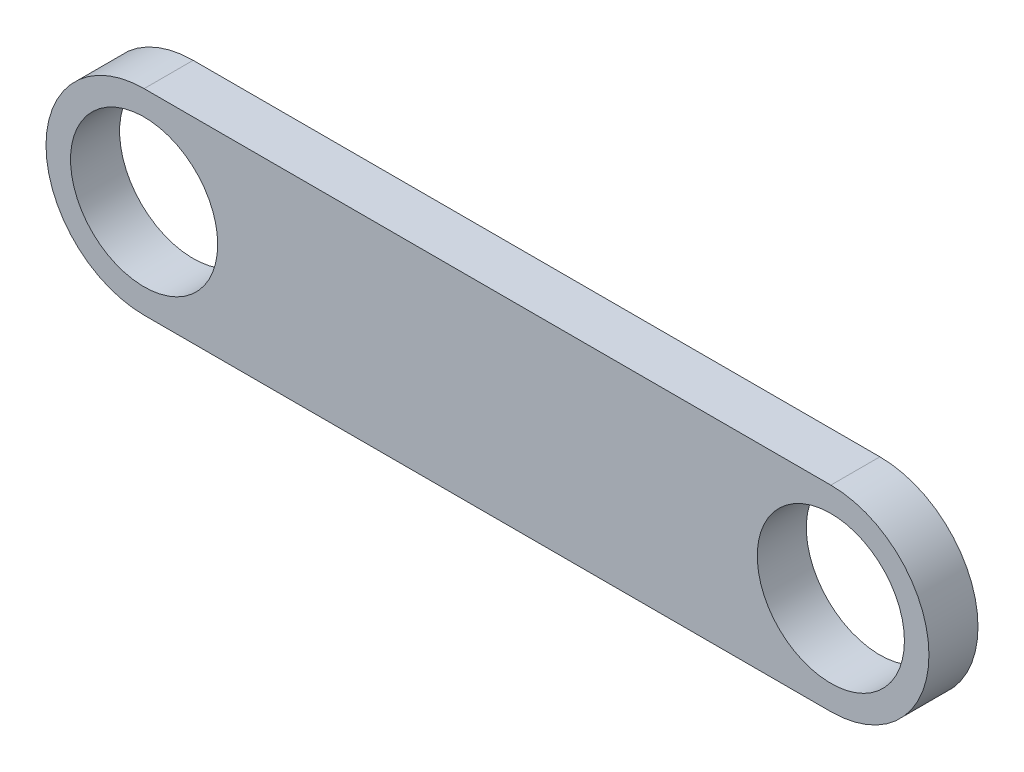
ISO-10303-21;
HEADER;
FILE_DESCRIPTION(('STEP AP214'),'2;1');
FILE_NAME('part.step','',(''),(''),'','','');
FILE_SCHEMA(('AUTOMOTIVE_DESIGN { 1 0 10303 214 1 1 1 1 }'));
ENDSEC;
DATA;
#1=APPLICATION_CONTEXT('core data for automotive mechanical design processes');
#2=APPLICATION_PROTOCOL_DEFINITION('international standard','automotive_design',2000,#1);
#3=PRODUCT_CONTEXT('',#1,'mechanical');
#4=PRODUCT('Part','Part','',(#3));
#5=PRODUCT_RELATED_PRODUCT_CATEGORY('part','',(#4));
#6=PRODUCT_DEFINITION_FORMATION('','',#4);
#7=PRODUCT_DEFINITION_CONTEXT('part definition',#1,'design');
#8=PRODUCT_DEFINITION('design','',#6,#7);
#9=PRODUCT_DEFINITION_SHAPE('','',#8);
#10=(LENGTH_UNIT() NAMED_UNIT(*) SI_UNIT(.MILLI.,.METRE.));
#11=(NAMED_UNIT(*) PLANE_ANGLE_UNIT() SI_UNIT($,.RADIAN.));
#12=(NAMED_UNIT(*) SI_UNIT($,.STERADIAN.) SOLID_ANGLE_UNIT());
#13=UNCERTAINTY_MEASURE_WITH_UNIT(LENGTH_MEASURE(1.E-05),#10,'distance_accuracy_value','');
#14=(GEOMETRIC_REPRESENTATION_CONTEXT(3) GLOBAL_UNCERTAINTY_ASSIGNED_CONTEXT((#13)) GLOBAL_UNIT_ASSIGNED_CONTEXT((#10,
#11,#12)) REPRESENTATION_CONTEXT('',''));
#15=CARTESIAN_POINT('',(0.,0.,0.));
#16=DIRECTION('',(0.,0.,1.));
#17=DIRECTION('',(1.,0.,0.));
#18=AXIS2_PLACEMENT_3D('',#15,#16,#17);
#19=CARTESIAN_POINT('',(0.,0.,10.));
#20=DIRECTION('',(0.,0.,1.));
#21=DIRECTION('',(1.,0.,0.));
#22=AXIS2_PLACEMENT_3D('',#19,#20,#21);
#23=PLANE('',#22);
#24=CARTESIAN_POINT('',(0.,0.,10.));
#25=DIRECTION('',(0.,0.,1.));
#26=DIRECTION('',(1.,0.,0.));
#27=AXIS2_PLACEMENT_3D('',#24,#25,#26);
#28=CIRCLE('',#27,15.);
#29=CARTESIAN_POINT('',(15.,0.,10.));
#30=VERTEX_POINT('',#29);
#31=EDGE_CURVE('E116',#30,#30,#28,.T.);
#32=ORIENTED_EDGE('',*,*,#31,.F.);
#33=EDGE_LOOP('',(#32));
#34=FACE_BOUND('',#33,.T.);
#35=CARTESIAN_POINT('',(0.,0.,10.));
#36=DIRECTION('',(0.,0.,1.));
#37=DIRECTION('',(1.,0.,0.));
#38=AXIS2_PLACEMENT_3D('',#35,#36,#37);
#39=CIRCLE('',#38,20.);
#40=CARTESIAN_POINT('',(0.,20.,10.));
#41=VERTEX_POINT('',#40);
#42=CARTESIAN_POINT('',(0.,-20.,10.));
#43=VERTEX_POINT('',#42);
#44=EDGE_CURVE('E96',#41,#43,#39,.T.);
#45=ORIENTED_EDGE('',*,*,#44,.T.);
#46=DIRECTION('',(1.,0.,0.));
#47=VECTOR('',#46,1.);
#48=CARTESIAN_POINT('',(0.,-20.,10.));
#49=LINE('',#48,#47);
#50=CARTESIAN_POINT('',(140.,-20.,10.));
#51=VERTEX_POINT('',#50);
#52=EDGE_CURVE('E91',#43,#51,#49,.T.);
#53=ORIENTED_EDGE('',*,*,#52,.T.);
#54=CARTESIAN_POINT('',(140.,0.,10.));
#55=DIRECTION('',(0.,0.,1.));
#56=DIRECTION('',(1.,0.,0.));
#57=AXIS2_PLACEMENT_3D('',#54,#55,#56);
#58=CIRCLE('',#57,20.);
#59=CARTESIAN_POINT('',(140.,20.,10.));
#60=VERTEX_POINT('',#59);
#61=EDGE_CURVE('E94',#51,#60,#58,.T.);
#62=ORIENTED_EDGE('',*,*,#61,.T.);
#63=DIRECTION('',(-1.,0.,0.));
#64=VECTOR('',#63,1.);
#65=CARTESIAN_POINT('',(0.,20.,10.));
#66=LINE('',#65,#64);
#67=EDGE_CURVE('E61',#60,#41,#66,.T.);
#68=ORIENTED_EDGE('',*,*,#67,.T.);
#69=EDGE_LOOP('',(#45,#53,#62,#68));
#70=FACE_BOUND('',#69,.T.);
#71=CARTESIAN_POINT('',(140.,0.,10.));
#72=DIRECTION('',(0.,0.,1.));
#73=DIRECTION('',(1.,0.,0.));
#74=AXIS2_PLACEMENT_3D('',#71,#72,#73);
#75=CIRCLE('',#74,15.);
#76=CARTESIAN_POINT('',(155.,0.,10.));
#77=VERTEX_POINT('',#76);
#78=EDGE_CURVE('E138',#77,#77,#75,.T.);
#79=ORIENTED_EDGE('',*,*,#78,.F.);
#80=EDGE_LOOP('',(#79));
#81=FACE_BOUND('',#80,.T.);
#82=ADVANCED_FACE('F43',(#34,#70,#81),#23,.T.);
#83=CARTESIAN_POINT('',(0.,0.,0.));
#84=DIRECTION('',(0.,0.,1.));
#85=DIRECTION('',(1.,0.,0.));
#86=AXIS2_PLACEMENT_3D('',#83,#84,#85);
#87=PLANE('',#86);
#88=CARTESIAN_POINT('',(0.,0.,0.));
#89=DIRECTION('',(0.,0.,1.));
#90=DIRECTION('',(1.,0.,0.));
#91=AXIS2_PLACEMENT_3D('',#88,#89,#90);
#92=CIRCLE('',#91,20.);
#93=CARTESIAN_POINT('',(0.,20.,0.));
#94=VERTEX_POINT('',#93);
#95=CARTESIAN_POINT('',(0.,-20.,0.));
#96=VERTEX_POINT('',#95);
#97=EDGE_CURVE('E112',#94,#96,#92,.T.);
#98=ORIENTED_EDGE('',*,*,#97,.F.);
#99=DIRECTION('',(-1.,0.,0.));
#100=VECTOR('',#99,1.);
#101=CARTESIAN_POINT('',(0.,20.,0.));
#102=LINE('',#101,#100);
#103=CARTESIAN_POINT('',(140.,20.,0.));
#104=VERTEX_POINT('',#103);
#105=EDGE_CURVE('E84',#104,#94,#102,.T.);
#106=ORIENTED_EDGE('',*,*,#105,.F.);
#107=CARTESIAN_POINT('',(140.,0.,0.));
#108=DIRECTION('',(0.,0.,1.));
#109=DIRECTION('',(1.,0.,0.));
#110=AXIS2_PLACEMENT_3D('',#107,#108,#109);
#111=CIRCLE('',#110,20.);
#112=CARTESIAN_POINT('',(140.,-20.,0.));
#113=VERTEX_POINT('',#112);
#114=EDGE_CURVE('E78',#113,#104,#111,.T.);
#115=ORIENTED_EDGE('',*,*,#114,.F.);
#116=DIRECTION('',(1.,0.,0.));
#117=VECTOR('',#116,1.);
#118=CARTESIAN_POINT('',(0.,-20.,0.));
#119=LINE('',#118,#117);
#120=EDGE_CURVE('E101',#96,#113,#119,.T.);
#121=ORIENTED_EDGE('',*,*,#120,.F.);
#122=EDGE_LOOP('',(#98,#106,#115,#121));
#123=FACE_BOUND('',#122,.T.);
#124=CARTESIAN_POINT('',(0.,0.,0.));
#125=DIRECTION('',(0.,0.,1.));
#126=DIRECTION('',(1.,0.,0.));
#127=AXIS2_PLACEMENT_3D('',#124,#125,#126);
#128=CIRCLE('',#127,15.);
#129=CARTESIAN_POINT('',(15.,0.,0.));
#130=VERTEX_POINT('',#129);
#131=EDGE_CURVE('E134',#130,#130,#128,.T.);
#132=ORIENTED_EDGE('',*,*,#131,.T.);
#133=EDGE_LOOP('',(#132));
#134=FACE_BOUND('',#133,.T.);
#135=CARTESIAN_POINT('',(140.,0.,0.));
#136=DIRECTION('',(0.,0.,1.));
#137=DIRECTION('',(1.,0.,0.));
#138=AXIS2_PLACEMENT_3D('',#135,#136,#137);
#139=CIRCLE('',#138,15.);
#140=CARTESIAN_POINT('',(155.,0.,0.));
#141=VERTEX_POINT('',#140);
#142=EDGE_CURVE('E142',#141,#141,#139,.T.);
#143=ORIENTED_EDGE('',*,*,#142,.T.);
#144=EDGE_LOOP('',(#143));
#145=FACE_BOUND('',#144,.T.);
#146=ADVANCED_FACE('F129',(#123,#134,#145),#87,.F.);
#147=CARTESIAN_POINT('',(0.,0.,10.));
#148=DIRECTION('',(0.,0.,-1.));
#149=DIRECTION('',(-1.,0.,0.));
#150=AXIS2_PLACEMENT_3D('',#147,#148,#149);
#151=CYLINDRICAL_SURFACE('',#150,20.);
#152=ORIENTED_EDGE('',*,*,#97,.T.);
#153=DIRECTION('',(0.,0.,-1.));
#154=VECTOR('',#153,1.);
#155=CARTESIAN_POINT('',(0.,-20.,10.));
#156=LINE('',#155,#154);
#157=EDGE_CURVE('E11',#43,#96,#156,.T.);
#158=ORIENTED_EDGE('',*,*,#157,.F.);
#159=ORIENTED_EDGE('',*,*,#44,.F.);
#160=DIRECTION('',(0.,0.,-1.));
#161=VECTOR('',#160,1.);
#162=CARTESIAN_POINT('',(0.,20.,10.));
#163=LINE('',#162,#161);
#164=EDGE_CURVE('E108',#41,#94,#163,.T.);
#165=ORIENTED_EDGE('',*,*,#164,.T.);
#166=EDGE_LOOP('',(#152,#158,#159,#165));
#167=FACE_BOUND('',#166,.T.);
#168=ADVANCED_FACE('F45',(#167),#151,.T.);
#169=CARTESIAN_POINT('',(0.,-20.,10.));
#170=DIRECTION('',(0.,1.,0.));
#171=DIRECTION('',(0.,0.,1.));
#172=AXIS2_PLACEMENT_3D('',#169,#170,#171);
#173=PLANE('',#172);
#174=ORIENTED_EDGE('',*,*,#120,.T.);
#175=DIRECTION('',(0.,0.,-1.));
#176=VECTOR('',#175,1.);
#177=CARTESIAN_POINT('',(140.,-20.,10.));
#178=LINE('',#177,#176);
#179=EDGE_CURVE('E53',#51,#113,#178,.T.);
#180=ORIENTED_EDGE('',*,*,#179,.F.);
#181=ORIENTED_EDGE('',*,*,#52,.F.);
#182=ORIENTED_EDGE('',*,*,#157,.T.);
#183=EDGE_LOOP('',(#174,#180,#181,#182));
#184=FACE_BOUND('',#183,.T.);
#185=ADVANCED_FACE('F100',(#184),#173,.F.);
#186=CARTESIAN_POINT('',(140.,0.,10.));
#187=DIRECTION('',(0.,0.,-1.));
#188=DIRECTION('',(-1.,0.,0.));
#189=AXIS2_PLACEMENT_3D('',#186,#187,#188);
#190=CYLINDRICAL_SURFACE('',#189,20.);
#191=ORIENTED_EDGE('',*,*,#114,.T.);
#192=DIRECTION('',(0.,0.,-1.));
#193=VECTOR('',#192,1.);
#194=CARTESIAN_POINT('',(140.,20.,10.));
#195=LINE('',#194,#193);
#196=EDGE_CURVE('E103',#60,#104,#195,.T.);
#197=ORIENTED_EDGE('',*,*,#196,.F.);
#198=ORIENTED_EDGE('',*,*,#61,.F.);
#199=ORIENTED_EDGE('',*,*,#179,.T.);
#200=EDGE_LOOP('',(#191,#197,#198,#199));
#201=FACE_BOUND('',#200,.T.);
#202=ADVANCED_FACE('F104',(#201),#190,.T.);
#203=CARTESIAN_POINT('',(0.,20.,10.));
#204=DIRECTION('',(0.,-1.,0.));
#205=DIRECTION('',(0.,0.,-1.));
#206=AXIS2_PLACEMENT_3D('',#203,#204,#205);
#207=PLANE('',#206);
#208=ORIENTED_EDGE('',*,*,#105,.T.);
#209=ORIENTED_EDGE('',*,*,#164,.F.);
#210=ORIENTED_EDGE('',*,*,#67,.F.);
#211=ORIENTED_EDGE('',*,*,#196,.T.);
#212=EDGE_LOOP('',(#208,#209,#210,#211));
#213=FACE_BOUND('',#212,.T.);
#214=ADVANCED_FACE('F126',(#213),#207,.F.);
#215=CARTESIAN_POINT('',(0.,0.,10.));
#216=DIRECTION('',(0.,0.,-1.));
#217=DIRECTION('',(-1.,0.,0.));
#218=AXIS2_PLACEMENT_3D('',#215,#216,#217);
#219=CYLINDRICAL_SURFACE('',#218,15.);
#220=ORIENTED_EDGE('',*,*,#31,.T.);
#221=EDGE_LOOP('',(#220));
#222=FACE_BOUND('',#221,.T.);
#223=ORIENTED_EDGE('',*,*,#131,.F.);
#224=EDGE_LOOP('',(#223));
#225=FACE_BOUND('',#224,.T.);
#226=ADVANCED_FACE('F161',(#222,#225),#219,.F.);
#227=CARTESIAN_POINT('',(140.,0.,10.));
#228=DIRECTION('',(0.,0.,-1.));
#229=DIRECTION('',(-1.,0.,0.));
#230=AXIS2_PLACEMENT_3D('',#227,#228,#229);
#231=CYLINDRICAL_SURFACE('',#230,15.);
#232=ORIENTED_EDGE('',*,*,#78,.T.);
#233=EDGE_LOOP('',(#232));
#234=FACE_BOUND('',#233,.T.);
#235=ORIENTED_EDGE('',*,*,#142,.F.);
#236=EDGE_LOOP('',(#235));
#237=FACE_BOUND('',#236,.T.);
#238=ADVANCED_FACE('F150',(#234,#237),#231,.F.);
#239=CLOSED_SHELL('',(#82,#146,#168,#185,#202,#214,#226,#238));
#240=MANIFOLD_SOLID_BREP('B2',#239);
#241=ADVANCED_BREP_SHAPE_REPRESENTATION('',(#18,#240),#14);
#242=SHAPE_DEFINITION_REPRESENTATION(#9,#241);
ENDSEC;
END-ISO-10303-21;
